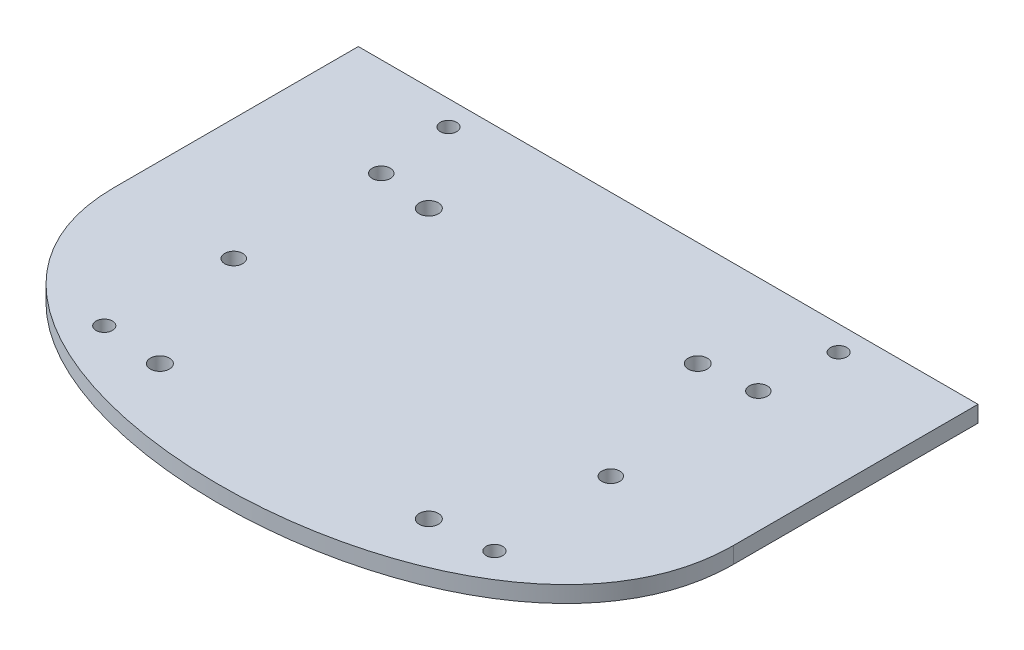
ISO-10303-21;
HEADER;
FILE_DESCRIPTION(('STEP AP214'),'2;1');
FILE_NAME('part.step','',(''),(''),'','','');
FILE_SCHEMA(('AUTOMOTIVE_DESIGN { 1 0 10303 214 1 1 1 1 }'));
ENDSEC;
DATA;
#1=APPLICATION_CONTEXT('core data for automotive mechanical design processes');
#2=APPLICATION_PROTOCOL_DEFINITION('international standard','automotive_design',2000,#1);
#3=PRODUCT_CONTEXT('',#1,'mechanical');
#4=PRODUCT('Part','Part','',(#3));
#5=PRODUCT_RELATED_PRODUCT_CATEGORY('part','',(#4));
#6=PRODUCT_DEFINITION_FORMATION('','',#4);
#7=PRODUCT_DEFINITION_CONTEXT('part definition',#1,'design');
#8=PRODUCT_DEFINITION('design','',#6,#7);
#9=PRODUCT_DEFINITION_SHAPE('','',#8);
#10=(LENGTH_UNIT() NAMED_UNIT(*) SI_UNIT(.MILLI.,.METRE.));
#11=(NAMED_UNIT(*) PLANE_ANGLE_UNIT() SI_UNIT($,.RADIAN.));
#12=(NAMED_UNIT(*) SI_UNIT($,.STERADIAN.) SOLID_ANGLE_UNIT());
#13=UNCERTAINTY_MEASURE_WITH_UNIT(LENGTH_MEASURE(1.E-05),#10,'distance_accuracy_value','');
#14=(GEOMETRIC_REPRESENTATION_CONTEXT(3) GLOBAL_UNCERTAINTY_ASSIGNED_CONTEXT((#13)) GLOBAL_UNIT_ASSIGNED_CONTEXT((#10,
#11,#12)) REPRESENTATION_CONTEXT('',''));
#15=CARTESIAN_POINT('',(0.,0.,0.));
#16=DIRECTION('',(0.,0.,1.));
#17=DIRECTION('',(1.,0.,0.));
#18=AXIS2_PLACEMENT_3D('',#15,#16,#17);
#19=CARTESIAN_POINT('',(-48.006,2.54,-34.798));
#20=DIRECTION('',(1.,0.,0.));
#21=DIRECTION('',(0.,0.,-1.));
#22=AXIS2_PLACEMENT_3D('',#19,#20,#21);
#23=PLANE('',#22);
#24=DIRECTION('',(0.,0.,1.));
#25=VECTOR('',#24,1.);
#26=CARTESIAN_POINT('',(-48.006,0.,-34.798));
#27=LINE('',#26,#25);
#28=CARTESIAN_POINT('',(-48.006,0.,-34.798));
#29=VERTEX_POINT('',#28);
#30=CARTESIAN_POINT('',(-48.006,0.,3.04800000000002));
#31=VERTEX_POINT('',#30);
#32=EDGE_CURVE('E99',#29,#31,#27,.T.);
#33=ORIENTED_EDGE('',*,*,#32,.T.);
#34=DIRECTION('',(0.,-1.,0.));
#35=VECTOR('',#34,1.);
#36=CARTESIAN_POINT('',(-48.006,2.54,3.04800000000002));
#37=LINE('',#36,#35);
#38=CARTESIAN_POINT('',(-48.006,2.54,3.04800000000002));
#39=VERTEX_POINT('',#38);
#40=EDGE_CURVE('E11',#39,#31,#37,.T.);
#41=ORIENTED_EDGE('',*,*,#40,.F.);
#42=DIRECTION('',(0.,0.,1.));
#43=VECTOR('',#42,1.);
#44=CARTESIAN_POINT('',(-48.006,2.54,-34.798));
#45=LINE('',#44,#43);
#46=CARTESIAN_POINT('',(-48.006,2.54,-34.798));
#47=VERTEX_POINT('',#46);
#48=EDGE_CURVE('E84',#47,#39,#45,.T.);
#49=ORIENTED_EDGE('',*,*,#48,.F.);
#50=DIRECTION('',(0.,-1.,0.));
#51=VECTOR('',#50,1.);
#52=CARTESIAN_POINT('',(-48.006,2.54,-34.798));
#53=LINE('',#52,#51);
#54=EDGE_CURVE('E92',#47,#29,#53,.T.);
#55=ORIENTED_EDGE('',*,*,#54,.T.);
#56=EDGE_LOOP('',(#33,#41,#49,#55));
#57=FACE_BOUND('',#56,.T.);
#58=ADVANCED_FACE('F33',(#57),#23,.F.);
#59=CARTESIAN_POINT('',(-48.006,2.54,3.04800000000002));
#60=CARTESIAN_POINT('',(-48.006,2.54,45.3813333333333));
#61=CARTESIAN_POINT('',(48.0060000000003,2.54,45.3813333333333));
#62=CARTESIAN_POINT('',(48.006,2.54,3.04800000000002));
#63=B_SPLINE_CURVE_WITH_KNOTS('',3,(#59,#60,#61,#62),.UNSPECIFIED.,.F.,.F.,(4,4),(0.,1.),.UNSPECIFIED.);
#64=DIRECTION('',(0.,-1.,0.));
#65=VECTOR('',#64,1.);
#66=SURFACE_OF_LINEAR_EXTRUSION('',#63,#65);
#67=CARTESIAN_POINT('',(-48.006,0.,3.04800000000002));
#68=CARTESIAN_POINT('',(-48.006,0.,45.3813333333333));
#69=CARTESIAN_POINT('',(48.0060000000003,0.,45.3813333333333));
#70=CARTESIAN_POINT('',(48.006,0.,3.04800000000002));
#71=B_SPLINE_CURVE_WITH_KNOTS('',3,(#67,#68,#69,#70),.UNSPECIFIED.,.F.,.F.,(4,4),(0.,1.),.UNSPECIFIED.);
#72=CARTESIAN_POINT('',(48.006,0.,3.04800000000001));
#73=VERTEX_POINT('',#72);
#74=EDGE_CURVE('E88',#31,#73,#71,.T.);
#75=ORIENTED_EDGE('',*,*,#74,.T.);
#76=DIRECTION('',(0.,-1.,0.));
#77=VECTOR('',#76,1.);
#78=CARTESIAN_POINT('',(48.006,2.54,3.04800000000001));
#79=LINE('',#78,#77);
#80=CARTESIAN_POINT('',(48.006,2.54,3.04800000000001));
#81=VERTEX_POINT('',#80);
#82=EDGE_CURVE('E41',#81,#73,#79,.T.);
#83=ORIENTED_EDGE('',*,*,#82,.F.);
#84=EDGE_CURVE('E79',#39,#81,#63,.T.);
#85=ORIENTED_EDGE('',*,*,#84,.F.);
#86=ORIENTED_EDGE('',*,*,#40,.T.);
#87=EDGE_LOOP('',(#75,#83,#85,#86));
#88=FACE_BOUND('',#87,.T.);
#89=ADVANCED_FACE('F87',(#88),#66,.F.);
#90=CARTESIAN_POINT('',(48.006,2.54,-34.798));
#91=DIRECTION('',(-1.,0.,0.));
#92=DIRECTION('',(0.,0.,1.));
#93=AXIS2_PLACEMENT_3D('',#90,#91,#92);
#94=PLANE('',#93);
#95=DIRECTION('',(0.,0.,-1.));
#96=VECTOR('',#95,1.);
#97=CARTESIAN_POINT('',(48.006,0.,-34.798));
#98=LINE('',#97,#96);
#99=CARTESIAN_POINT('',(48.006,0.,-34.798));
#100=VERTEX_POINT('',#99);
#101=EDGE_CURVE('E66',#73,#100,#98,.T.);
#102=ORIENTED_EDGE('',*,*,#101,.T.);
#103=DIRECTION('',(0.,-1.,0.));
#104=VECTOR('',#103,1.);
#105=CARTESIAN_POINT('',(48.006,2.54,-34.798));
#106=LINE('',#105,#104);
#107=CARTESIAN_POINT('',(48.006,2.54,-34.798));
#108=VERTEX_POINT('',#107);
#109=EDGE_CURVE('E89',#108,#100,#106,.T.);
#110=ORIENTED_EDGE('',*,*,#109,.F.);
#111=DIRECTION('',(0.,0.,-1.));
#112=VECTOR('',#111,1.);
#113=CARTESIAN_POINT('',(48.006,2.54,-34.798));
#114=LINE('',#113,#112);
#115=EDGE_CURVE('E82',#81,#108,#114,.T.);
#116=ORIENTED_EDGE('',*,*,#115,.F.);
#117=ORIENTED_EDGE('',*,*,#82,.T.);
#118=EDGE_LOOP('',(#102,#110,#116,#117));
#119=FACE_BOUND('',#118,.T.);
#120=ADVANCED_FACE('F90',(#119),#94,.F.);
#121=CARTESIAN_POINT('',(48.006,2.54,-34.798));
#122=DIRECTION('',(0.,0.,1.));
#123=DIRECTION('',(1.,0.,0.));
#124=AXIS2_PLACEMENT_3D('',#121,#122,#123);
#125=PLANE('',#124);
#126=DIRECTION('',(-1.,0.,0.));
#127=VECTOR('',#126,1.);
#128=CARTESIAN_POINT('',(48.006,0.,-34.798));
#129=LINE('',#128,#127);
#130=EDGE_CURVE('E72',#100,#29,#129,.T.);
#131=ORIENTED_EDGE('',*,*,#130,.T.);
#132=ORIENTED_EDGE('',*,*,#54,.F.);
#133=DIRECTION('',(-1.,0.,0.));
#134=VECTOR('',#133,1.);
#135=CARTESIAN_POINT('',(48.006,2.54,-34.798));
#136=LINE('',#135,#134);
#137=EDGE_CURVE('E49',#108,#47,#136,.T.);
#138=ORIENTED_EDGE('',*,*,#137,.F.);
#139=ORIENTED_EDGE('',*,*,#109,.T.);
#140=EDGE_LOOP('',(#131,#132,#138,#139));
#141=FACE_BOUND('',#140,.T.);
#142=ADVANCED_FACE('F112',(#141),#125,.F.);
#143=CARTESIAN_POINT('',(1.21430643318376E-13,2.54,34.798));
#144=DIRECTION('',(0.,-1.,0.));
#145=DIRECTION('',(0.,0.,-1.));
#146=AXIS2_PLACEMENT_3D('',#143,#144,#145);
#147=PLANE('',#146);
#148=CARTESIAN_POINT('',(30.226,2.54,-30.988));
#149=DIRECTION('',(0.,-1.,0.));
#150=DIRECTION('',(0.,0.,-1.));
#151=AXIS2_PLACEMENT_3D('',#148,#149,#150);
#152=CIRCLE('',#151,1.27);
#153=CARTESIAN_POINT('',(30.226,2.54,-32.258));
#154=VERTEX_POINT('',#153);
#155=EDGE_CURVE('E102',#154,#154,#152,.T.);
#156=ORIENTED_EDGE('',*,*,#155,.T.);
#157=EDGE_LOOP('',(#156));
#158=FACE_BOUND('',#157,.T.);
#159=CARTESIAN_POINT('',(30.226,2.54,22.352));
#160=DIRECTION('',(0.,-1.,0.));
#161=DIRECTION('',(0.,0.,-1.));
#162=AXIS2_PLACEMENT_3D('',#159,#160,#161);
#163=CIRCLE('',#162,1.27);
#164=CARTESIAN_POINT('',(30.226,2.54,21.082));
#165=VERTEX_POINT('',#164);
#166=EDGE_CURVE('E120',#165,#165,#163,.T.);
#167=ORIENTED_EDGE('',*,*,#166,.T.);
#168=EDGE_LOOP('',(#167));
#169=FACE_BOUND('',#168,.T.);
#170=CARTESIAN_POINT('',(-30.226,2.54,22.352));
#171=DIRECTION('',(0.,-1.,0.));
#172=DIRECTION('',(0.,0.,-1.));
#173=AXIS2_PLACEMENT_3D('',#170,#171,#172);
#174=CIRCLE('',#173,1.26999999999999);
#175=CARTESIAN_POINT('',(-30.226,2.54,21.082));
#176=VERTEX_POINT('',#175);
#177=EDGE_CURVE('E123',#176,#176,#174,.T.);
#178=ORIENTED_EDGE('',*,*,#177,.T.);
#179=EDGE_LOOP('',(#178));
#180=FACE_BOUND('',#179,.T.);
#181=CARTESIAN_POINT('',(20.8341942008805,2.54,-18.5481942008803));
#182=DIRECTION('',(0.,-1.,0.));
#183=DIRECTION('',(0.,0.,-1.));
#184=AXIS2_PLACEMENT_3D('',#181,#182,#183);
#185=CIRCLE('',#184,1.48039673463641);
#186=CARTESIAN_POINT('',(20.8341942008805,2.54,-20.0285909355167));
#187=VERTEX_POINT('',#186);
#188=EDGE_CURVE('E126',#187,#187,#185,.T.);
#189=ORIENTED_EDGE('',*,*,#188,.T.);
#190=EDGE_LOOP('',(#189));
#191=FACE_BOUND('',#190,.T.);
#192=CARTESIAN_POINT('',(-30.226,2.54,-30.988));
#193=DIRECTION('',(0.,-1.,0.));
#194=DIRECTION('',(0.,0.,-1.));
#195=AXIS2_PLACEMENT_3D('',#192,#193,#194);
#196=CIRCLE('',#195,1.27);
#197=CARTESIAN_POINT('',(-30.226,2.54,-32.258));
#198=VERTEX_POINT('',#197);
#199=EDGE_CURVE('E129',#198,#198,#196,.T.);
#200=ORIENTED_EDGE('',*,*,#199,.T.);
#201=EDGE_LOOP('',(#200));
#202=FACE_BOUND('',#201,.T.);
#203=CARTESIAN_POINT('',(29.21,2.54,-19.558));
#204=DIRECTION('',(0.,-1.,0.));
#205=DIRECTION('',(0.,0.,-1.));
#206=AXIS2_PLACEMENT_3D('',#203,#204,#205);
#207=CIRCLE('',#206,1.397);
#208=CARTESIAN_POINT('',(29.21,2.54,-20.955));
#209=VERTEX_POINT('',#208);
#210=EDGE_CURVE('E132',#209,#209,#207,.T.);
#211=ORIENTED_EDGE('',*,*,#210,.T.);
#212=EDGE_LOOP('',(#211));
#213=FACE_BOUND('',#212,.T.);
#214=CARTESIAN_POINT('',(29.21,2.54,3.30199999999999));
#215=DIRECTION('',(0.,-1.,0.));
#216=DIRECTION('',(0.,0.,-1.));
#217=AXIS2_PLACEMENT_3D('',#214,#215,#216);
#218=CIRCLE('',#217,1.397);
#219=CARTESIAN_POINT('',(29.21,2.54,1.90499999999999));
#220=VERTEX_POINT('',#219);
#221=EDGE_CURVE('E135',#220,#220,#218,.T.);
#222=ORIENTED_EDGE('',*,*,#221,.T.);
#223=EDGE_LOOP('',(#222));
#224=FACE_BOUND('',#223,.T.);
#225=CARTESIAN_POINT('',(-29.21,2.54,3.30199999999999));
#226=DIRECTION('',(0.,-1.,0.));
#227=DIRECTION('',(0.,0.,-1.));
#228=AXIS2_PLACEMENT_3D('',#225,#226,#227);
#229=CIRCLE('',#228,1.397);
#230=CARTESIAN_POINT('',(-29.21,2.54,1.90499999999999));
#231=VERTEX_POINT('',#230);
#232=EDGE_CURVE('E138',#231,#231,#229,.T.);
#233=ORIENTED_EDGE('',*,*,#232,.T.);
#234=EDGE_LOOP('',(#233));
#235=FACE_BOUND('',#234,.T.);
#236=CARTESIAN_POINT('',(-20.8341942008805,2.54,23.1201942008803));
#237=DIRECTION('',(0.,-1.,0.));
#238=DIRECTION('',(0.,0.,-1.));
#239=AXIS2_PLACEMENT_3D('',#236,#237,#238);
#240=CIRCLE('',#239,1.48039673463641);
#241=CARTESIAN_POINT('',(-20.8341942008805,2.54,21.6397974662439));
#242=VERTEX_POINT('',#241);
#243=EDGE_CURVE('E141',#242,#242,#240,.T.);
#244=ORIENTED_EDGE('',*,*,#243,.T.);
#245=EDGE_LOOP('',(#244));
#246=FACE_BOUND('',#245,.T.);
#247=CARTESIAN_POINT('',(-20.8341942008805,2.54,-18.5481942008803));
#248=DIRECTION('',(0.,-1.,0.));
#249=DIRECTION('',(0.,0.,-1.));
#250=AXIS2_PLACEMENT_3D('',#247,#248,#249);
#251=CIRCLE('',#250,1.48039673463641);
#252=CARTESIAN_POINT('',(-20.8341942008805,2.54,-20.0285909355167));
#253=VERTEX_POINT('',#252);
#254=EDGE_CURVE('E144',#253,#253,#251,.T.);
#255=ORIENTED_EDGE('',*,*,#254,.T.);
#256=EDGE_LOOP('',(#255));
#257=FACE_BOUND('',#256,.T.);
#258=CARTESIAN_POINT('',(20.8341942008805,2.54,23.1201942008803));
#259=DIRECTION('',(0.,-1.,0.));
#260=DIRECTION('',(0.,0.,-1.));
#261=AXIS2_PLACEMENT_3D('',#258,#259,#260);
#262=CIRCLE('',#261,1.48039673463641);
#263=CARTESIAN_POINT('',(20.8341942008805,2.54,21.6397974662439));
#264=VERTEX_POINT('',#263);
#265=EDGE_CURVE('E147',#264,#264,#262,.T.);
#266=ORIENTED_EDGE('',*,*,#265,.T.);
#267=EDGE_LOOP('',(#266));
#268=FACE_BOUND('',#267,.T.);
#269=CARTESIAN_POINT('',(-29.21,2.54,-19.558));
#270=DIRECTION('',(0.,-1.,0.));
#271=DIRECTION('',(0.,0.,-1.));
#272=AXIS2_PLACEMENT_3D('',#269,#270,#271);
#273=CIRCLE('',#272,1.397);
#274=CARTESIAN_POINT('',(-29.21,2.54,-20.955));
#275=VERTEX_POINT('',#274);
#276=EDGE_CURVE('E150',#275,#275,#273,.T.);
#277=ORIENTED_EDGE('',*,*,#276,.T.);
#278=EDGE_LOOP('',(#277));
#279=FACE_BOUND('',#278,.T.);
#280=ORIENTED_EDGE('',*,*,#48,.T.);
#281=ORIENTED_EDGE('',*,*,#84,.T.);
#282=ORIENTED_EDGE('',*,*,#115,.T.);
#283=ORIENTED_EDGE('',*,*,#137,.T.);
#284=EDGE_LOOP('',(#280,#281,#282,#283));
#285=FACE_BOUND('',#284,.T.);
#286=ADVANCED_FACE('F80',(#158,#169,#180,#191,#202,#213,#224,#235,#246,#257,#268,#279,#285),
#147,.F.);
#287=CARTESIAN_POINT('',(1.21430643318376E-13,0.,34.798));
#288=DIRECTION('',(0.,-1.,0.));
#289=DIRECTION('',(0.,0.,-1.));
#290=AXIS2_PLACEMENT_3D('',#287,#288,#289);
#291=PLANE('',#290);
#292=CARTESIAN_POINT('',(30.226,0.,-30.988));
#293=DIRECTION('',(0.,1.,0.));
#294=DIRECTION('',(0.,0.,-1.));
#295=AXIS2_PLACEMENT_3D('',#292,#293,#294);
#296=CIRCLE('',#295,1.27);
#297=CARTESIAN_POINT('',(30.226,0.,-32.258));
#298=VERTEX_POINT('',#297);
#299=EDGE_CURVE('E169',#298,#298,#296,.T.);
#300=ORIENTED_EDGE('',*,*,#299,.T.);
#301=EDGE_LOOP('',(#300));
#302=FACE_BOUND('',#301,.T.);
#303=CARTESIAN_POINT('',(30.226,0.,22.352));
#304=DIRECTION('',(0.,1.,0.));
#305=DIRECTION('',(0.,0.,-1.));
#306=AXIS2_PLACEMENT_3D('',#303,#304,#305);
#307=CIRCLE('',#306,1.27);
#308=CARTESIAN_POINT('',(30.226,0.,21.082));
#309=VERTEX_POINT('',#308);
#310=EDGE_CURVE('E172',#309,#309,#307,.T.);
#311=ORIENTED_EDGE('',*,*,#310,.T.);
#312=EDGE_LOOP('',(#311));
#313=FACE_BOUND('',#312,.T.);
#314=CARTESIAN_POINT('',(-30.226,0.,22.352));
#315=DIRECTION('',(0.,1.,0.));
#316=DIRECTION('',(0.,0.,1.));
#317=AXIS2_PLACEMENT_3D('',#314,#315,#316);
#318=CIRCLE('',#317,1.26999999999999);
#319=CARTESIAN_POINT('',(-30.226,0.,23.622));
#320=VERTEX_POINT('',#319);
#321=EDGE_CURVE('E176',#320,#320,#318,.T.);
#322=ORIENTED_EDGE('',*,*,#321,.T.);
#323=EDGE_LOOP('',(#322));
#324=FACE_BOUND('',#323,.T.);
#325=CARTESIAN_POINT('',(20.8341942008805,0.,-18.5481942008803));
#326=DIRECTION('',(0.,1.,0.));
#327=DIRECTION('',(0.,0.,1.));
#328=AXIS2_PLACEMENT_3D('',#325,#326,#327);
#329=CIRCLE('',#328,1.48039673463641);
#330=CARTESIAN_POINT('',(20.8341942008805,0.,-17.0677974662439));
#331=VERTEX_POINT('',#330);
#332=EDGE_CURVE('E161',#331,#331,#329,.T.);
#333=ORIENTED_EDGE('',*,*,#332,.T.);
#334=EDGE_LOOP('',(#333));
#335=FACE_BOUND('',#334,.T.);
#336=CARTESIAN_POINT('',(-30.226,0.,-30.988));
#337=DIRECTION('',(0.,1.,0.));
#338=DIRECTION('',(0.,0.,1.));
#339=AXIS2_PLACEMENT_3D('',#336,#337,#338);
#340=CIRCLE('',#339,1.27);
#341=CARTESIAN_POINT('',(-30.226,0.,-29.718));
#342=VERTEX_POINT('',#341);
#343=EDGE_CURVE('E157',#342,#342,#340,.T.);
#344=ORIENTED_EDGE('',*,*,#343,.T.);
#345=EDGE_LOOP('',(#344));
#346=FACE_BOUND('',#345,.T.);
#347=CARTESIAN_POINT('',(29.21,0.,-19.558));
#348=DIRECTION('',(0.,1.,0.));
#349=DIRECTION('',(0.,0.,-1.));
#350=AXIS2_PLACEMENT_3D('',#347,#348,#349);
#351=CIRCLE('',#350,1.397);
#352=CARTESIAN_POINT('',(29.21,0.,-20.955));
#353=VERTEX_POINT('',#352);
#354=EDGE_CURVE('E160',#353,#353,#351,.T.);
#355=ORIENTED_EDGE('',*,*,#354,.T.);
#356=EDGE_LOOP('',(#355));
#357=FACE_BOUND('',#356,.T.);
#358=CARTESIAN_POINT('',(29.21,0.,3.30199999999999));
#359=DIRECTION('',(0.,1.,0.));
#360=DIRECTION('',(0.,0.,-1.));
#361=AXIS2_PLACEMENT_3D('',#358,#359,#360);
#362=CIRCLE('',#361,1.397);
#363=CARTESIAN_POINT('',(29.21,0.,1.90499999999999));
#364=VERTEX_POINT('',#363);
#365=EDGE_CURVE('E164',#364,#364,#362,.T.);
#366=ORIENTED_EDGE('',*,*,#365,.T.);
#367=EDGE_LOOP('',(#366));
#368=FACE_BOUND('',#367,.T.);
#369=CARTESIAN_POINT('',(-29.21,0.,3.30199999999999));
#370=DIRECTION('',(0.,1.,0.));
#371=DIRECTION('',(0.,0.,1.));
#372=AXIS2_PLACEMENT_3D('',#369,#370,#371);
#373=CIRCLE('',#372,1.397);
#374=CARTESIAN_POINT('',(-29.21,0.,4.69899999999999));
#375=VERTEX_POINT('',#374);
#376=EDGE_CURVE('E156',#375,#375,#373,.T.);
#377=ORIENTED_EDGE('',*,*,#376,.T.);
#378=EDGE_LOOP('',(#377));
#379=FACE_BOUND('',#378,.T.);
#380=CARTESIAN_POINT('',(-20.8341942008805,0.,23.1201942008803));
#381=DIRECTION('',(0.,1.,0.));
#382=DIRECTION('',(0.,0.,1.));
#383=AXIS2_PLACEMENT_3D('',#380,#381,#382);
#384=CIRCLE('',#383,1.48039673463641);
#385=CARTESIAN_POINT('',(-20.8341942008805,0.,24.6005909355167));
#386=VERTEX_POINT('',#385);
#387=EDGE_CURVE('E184',#386,#386,#384,.T.);
#388=ORIENTED_EDGE('',*,*,#387,.T.);
#389=EDGE_LOOP('',(#388));
#390=FACE_BOUND('',#389,.T.);
#391=CARTESIAN_POINT('',(-20.8341942008805,0.,-18.5481942008803));
#392=DIRECTION('',(0.,1.,0.));
#393=DIRECTION('',(0.,0.,-1.));
#394=AXIS2_PLACEMENT_3D('',#391,#392,#393);
#395=CIRCLE('',#394,1.48039673463641);
#396=CARTESIAN_POINT('',(-20.8341942008805,0.,-20.0285909355167));
#397=VERTEX_POINT('',#396);
#398=EDGE_CURVE('E181',#397,#397,#395,.T.);
#399=ORIENTED_EDGE('',*,*,#398,.T.);
#400=EDGE_LOOP('',(#399));
#401=FACE_BOUND('',#400,.T.);
#402=CARTESIAN_POINT('',(20.8341942008805,0.,23.1201942008803));
#403=DIRECTION('',(0.,1.,0.));
#404=DIRECTION('',(0.,0.,-1.));
#405=AXIS2_PLACEMENT_3D('',#402,#403,#404);
#406=CIRCLE('',#405,1.48039673463641);
#407=CARTESIAN_POINT('',(20.8341942008805,0.,21.6397974662439));
#408=VERTEX_POINT('',#407);
#409=EDGE_CURVE('E173',#408,#408,#406,.T.);
#410=ORIENTED_EDGE('',*,*,#409,.T.);
#411=EDGE_LOOP('',(#410));
#412=FACE_BOUND('',#411,.T.);
#413=CARTESIAN_POINT('',(-29.21,0.,-19.558));
#414=DIRECTION('',(0.,1.,0.));
#415=DIRECTION('',(0.,0.,1.));
#416=AXIS2_PLACEMENT_3D('',#413,#414,#415);
#417=CIRCLE('',#416,1.397);
#418=CARTESIAN_POINT('',(-29.21,0.,-18.161));
#419=VERTEX_POINT('',#418);
#420=EDGE_CURVE('E153',#419,#419,#417,.T.);
#421=ORIENTED_EDGE('',*,*,#420,.T.);
#422=EDGE_LOOP('',(#421));
#423=FACE_BOUND('',#422,.T.);
#424=ORIENTED_EDGE('',*,*,#32,.F.);
#425=ORIENTED_EDGE('',*,*,#130,.F.);
#426=ORIENTED_EDGE('',*,*,#101,.F.);
#427=ORIENTED_EDGE('',*,*,#74,.F.);
#428=EDGE_LOOP('',(#424,#425,#426,#427));
#429=FACE_BOUND('',#428,.T.);
#430=ADVANCED_FACE('F115',(#302,#313,#324,#335,#346,#357,#368,#379,#390,#401,#412,#423,#429),
#291,.T.);
#431=CARTESIAN_POINT('',(-29.21,0.,-19.558));
#432=DIRECTION('',(0.,1.,0.));
#433=DIRECTION('',(0.,0.,1.));
#434=AXIS2_PLACEMENT_3D('',#431,#432,#433);
#435=CYLINDRICAL_SURFACE('',#434,1.397);
#436=ORIENTED_EDGE('',*,*,#420,.F.);
#437=EDGE_LOOP('',(#436));
#438=FACE_BOUND('',#437,.T.);
#439=ORIENTED_EDGE('',*,*,#276,.F.);
#440=EDGE_LOOP('',(#439));
#441=FACE_BOUND('',#440,.T.);
#442=ADVANCED_FACE('F210',(#438,#441),#435,.F.);
#443=CARTESIAN_POINT('',(20.8341942008805,0.,23.1201942008803));
#444=DIRECTION('',(0.,1.,0.));
#445=DIRECTION('',(0.,0.,1.));
#446=AXIS2_PLACEMENT_3D('',#443,#444,#445);
#447=CYLINDRICAL_SURFACE('',#446,1.48039673463641);
#448=ORIENTED_EDGE('',*,*,#409,.F.);
#449=EDGE_LOOP('',(#448));
#450=FACE_BOUND('',#449,.T.);
#451=ORIENTED_EDGE('',*,*,#265,.F.);
#452=EDGE_LOOP('',(#451));
#453=FACE_BOUND('',#452,.T.);
#454=ADVANCED_FACE('F212',(#450,#453),#447,.F.);
#455=CARTESIAN_POINT('',(-20.8341942008805,0.,-18.5481942008803));
#456=DIRECTION('',(0.,1.,0.));
#457=DIRECTION('',(0.,0.,1.));
#458=AXIS2_PLACEMENT_3D('',#455,#456,#457);
#459=CYLINDRICAL_SURFACE('',#458,1.48039673463641);
#460=ORIENTED_EDGE('',*,*,#398,.F.);
#461=EDGE_LOOP('',(#460));
#462=FACE_BOUND('',#461,.T.);
#463=ORIENTED_EDGE('',*,*,#254,.F.);
#464=EDGE_LOOP('',(#463));
#465=FACE_BOUND('',#464,.T.);
#466=ADVANCED_FACE('F196',(#462,#465),#459,.F.);
#467=CARTESIAN_POINT('',(-20.8341942008805,0.,23.1201942008803));
#468=DIRECTION('',(0.,1.,0.));
#469=DIRECTION('',(0.,0.,1.));
#470=AXIS2_PLACEMENT_3D('',#467,#468,#469);
#471=CYLINDRICAL_SURFACE('',#470,1.48039673463641);
#472=ORIENTED_EDGE('',*,*,#387,.F.);
#473=EDGE_LOOP('',(#472));
#474=FACE_BOUND('',#473,.T.);
#475=ORIENTED_EDGE('',*,*,#243,.F.);
#476=EDGE_LOOP('',(#475));
#477=FACE_BOUND('',#476,.T.);
#478=ADVANCED_FACE('F192',(#474,#477),#471,.F.);
#479=CARTESIAN_POINT('',(-29.21,0.,3.30199999999999));
#480=DIRECTION('',(0.,1.,0.));
#481=DIRECTION('',(0.,0.,1.));
#482=AXIS2_PLACEMENT_3D('',#479,#480,#481);
#483=CYLINDRICAL_SURFACE('',#482,1.397);
#484=ORIENTED_EDGE('',*,*,#376,.F.);
#485=EDGE_LOOP('',(#484));
#486=FACE_BOUND('',#485,.T.);
#487=ORIENTED_EDGE('',*,*,#232,.F.);
#488=EDGE_LOOP('',(#487));
#489=FACE_BOUND('',#488,.T.);
#490=ADVANCED_FACE('F195',(#486,#489),#483,.F.);
#491=CARTESIAN_POINT('',(29.21,0.,3.30199999999999));
#492=DIRECTION('',(0.,1.,0.));
#493=DIRECTION('',(0.,0.,1.));
#494=AXIS2_PLACEMENT_3D('',#491,#492,#493);
#495=CYLINDRICAL_SURFACE('',#494,1.397);
#496=ORIENTED_EDGE('',*,*,#365,.F.);
#497=EDGE_LOOP('',(#496));
#498=FACE_BOUND('',#497,.T.);
#499=ORIENTED_EDGE('',*,*,#221,.F.);
#500=EDGE_LOOP('',(#499));
#501=FACE_BOUND('',#500,.T.);
#502=ADVANCED_FACE('F281',(#498,#501),#495,.F.);
#503=CARTESIAN_POINT('',(29.21,0.,-19.558));
#504=DIRECTION('',(0.,1.,0.));
#505=DIRECTION('',(0.,0.,1.));
#506=AXIS2_PLACEMENT_3D('',#503,#504,#505);
#507=CYLINDRICAL_SURFACE('',#506,1.397);
#508=ORIENTED_EDGE('',*,*,#354,.F.);
#509=EDGE_LOOP('',(#508));
#510=FACE_BOUND('',#509,.T.);
#511=ORIENTED_EDGE('',*,*,#210,.F.);
#512=EDGE_LOOP('',(#511));
#513=FACE_BOUND('',#512,.T.);
#514=ADVANCED_FACE('F291',(#510,#513),#507,.F.);
#515=CARTESIAN_POINT('',(-30.226,0.,-30.988));
#516=DIRECTION('',(0.,1.,0.));
#517=DIRECTION('',(0.,0.,1.));
#518=AXIS2_PLACEMENT_3D('',#515,#516,#517);
#519=CYLINDRICAL_SURFACE('',#518,1.27);
#520=ORIENTED_EDGE('',*,*,#343,.F.);
#521=EDGE_LOOP('',(#520));
#522=FACE_BOUND('',#521,.T.);
#523=ORIENTED_EDGE('',*,*,#199,.F.);
#524=EDGE_LOOP('',(#523));
#525=FACE_BOUND('',#524,.T.);
#526=ADVANCED_FACE('F301',(#522,#525),#519,.F.);
#527=CARTESIAN_POINT('',(20.8341942008805,0.,-18.5481942008803));
#528=DIRECTION('',(0.,1.,0.));
#529=DIRECTION('',(0.,0.,1.));
#530=AXIS2_PLACEMENT_3D('',#527,#528,#529);
#531=CYLINDRICAL_SURFACE('',#530,1.48039673463641);
#532=ORIENTED_EDGE('',*,*,#332,.F.);
#533=EDGE_LOOP('',(#532));
#534=FACE_BOUND('',#533,.T.);
#535=ORIENTED_EDGE('',*,*,#188,.F.);
#536=EDGE_LOOP('',(#535));
#537=FACE_BOUND('',#536,.T.);
#538=ADVANCED_FACE('F311',(#534,#537),#531,.F.);
#539=CARTESIAN_POINT('',(-30.226,0.,22.352));
#540=DIRECTION('',(0.,1.,0.));
#541=DIRECTION('',(0.,0.,1.));
#542=AXIS2_PLACEMENT_3D('',#539,#540,#541);
#543=CYLINDRICAL_SURFACE('',#542,1.26999999999999);
#544=ORIENTED_EDGE('',*,*,#321,.F.);
#545=EDGE_LOOP('',(#544));
#546=FACE_BOUND('',#545,.T.);
#547=ORIENTED_EDGE('',*,*,#177,.F.);
#548=EDGE_LOOP('',(#547));
#549=FACE_BOUND('',#548,.T.);
#550=ADVANCED_FACE('F320',(#546,#549),#543,.F.);
#551=CARTESIAN_POINT('',(30.226,0.,22.352));
#552=DIRECTION('',(0.,1.,0.));
#553=DIRECTION('',(0.,0.,1.));
#554=AXIS2_PLACEMENT_3D('',#551,#552,#553);
#555=CYLINDRICAL_SURFACE('',#554,1.27);
#556=ORIENTED_EDGE('',*,*,#310,.F.);
#557=EDGE_LOOP('',(#556));
#558=FACE_BOUND('',#557,.T.);
#559=ORIENTED_EDGE('',*,*,#166,.F.);
#560=EDGE_LOOP('',(#559));
#561=FACE_BOUND('',#560,.T.);
#562=ADVANCED_FACE('F330',(#558,#561),#555,.F.);
#563=CARTESIAN_POINT('',(30.226,0.,-30.988));
#564=DIRECTION('',(0.,1.,0.));
#565=DIRECTION('',(0.,0.,1.));
#566=AXIS2_PLACEMENT_3D('',#563,#564,#565);
#567=CYLINDRICAL_SURFACE('',#566,1.27);
#568=ORIENTED_EDGE('',*,*,#299,.F.);
#569=EDGE_LOOP('',(#568));
#570=FACE_BOUND('',#569,.T.);
#571=ORIENTED_EDGE('',*,*,#155,.F.);
#572=EDGE_LOOP('',(#571));
#573=FACE_BOUND('',#572,.T.);
#574=ADVANCED_FACE('F340',(#570,#573),#567,.F.);
#575=CLOSED_SHELL('',(#58,#89,#120,#142,#286,#430,#442,#454,#466,#478,#490,#502,#514,#526,#538,
#550,#562,#574));
#576=MANIFOLD_SOLID_BREP('B2',#575);
#577=ADVANCED_BREP_SHAPE_REPRESENTATION('',(#18,#576),#14);
#578=SHAPE_DEFINITION_REPRESENTATION(#9,#577);
ENDSEC;
END-ISO-10303-21;
